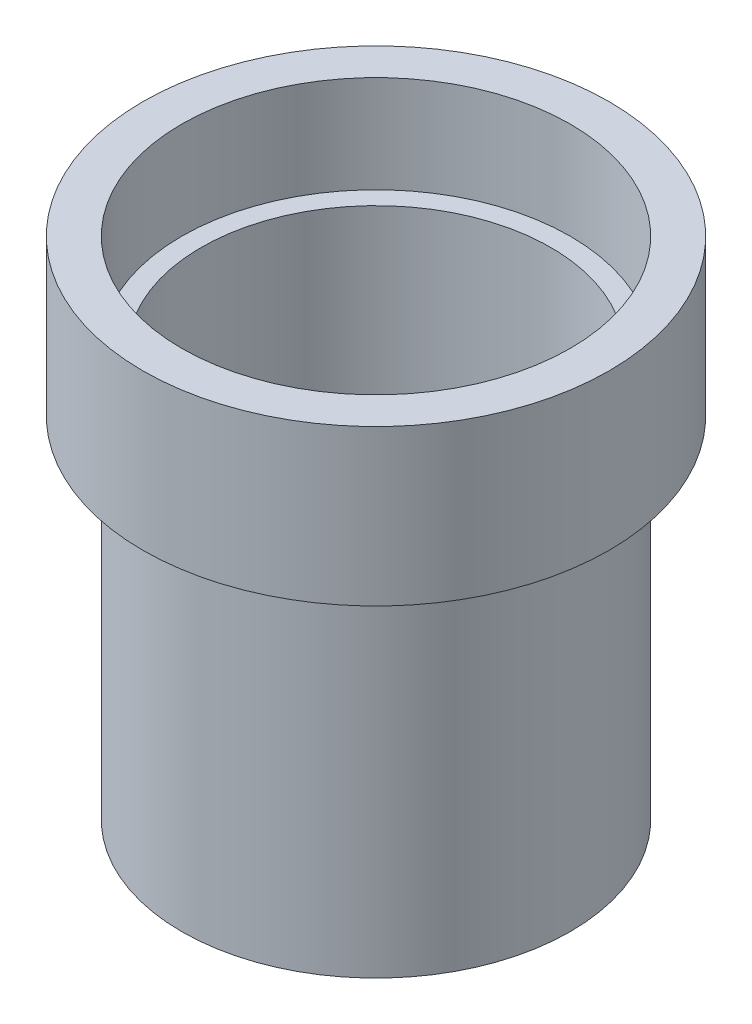
ISO-10303-21;
HEADER;
FILE_DESCRIPTION(('STEP AP214'),'2;1');
FILE_NAME('part.step','',(''),(''),'','','');
FILE_SCHEMA(('AUTOMOTIVE_DESIGN { 1 0 10303 214 1 1 1 1 }'));
ENDSEC;
DATA;
#1=APPLICATION_CONTEXT('core data for automotive mechanical design processes');
#2=APPLICATION_PROTOCOL_DEFINITION('international standard','automotive_design',2000,#1);
#3=PRODUCT_CONTEXT('',#1,'mechanical');
#4=PRODUCT('Part','Part','',(#3));
#5=PRODUCT_RELATED_PRODUCT_CATEGORY('part','',(#4));
#6=PRODUCT_DEFINITION_FORMATION('','',#4);
#7=PRODUCT_DEFINITION_CONTEXT('part definition',#1,'design');
#8=PRODUCT_DEFINITION('design','',#6,#7);
#9=PRODUCT_DEFINITION_SHAPE('','',#8);
#10=(LENGTH_UNIT() NAMED_UNIT(*) SI_UNIT(.MILLI.,.METRE.));
#11=(NAMED_UNIT(*) PLANE_ANGLE_UNIT() SI_UNIT($,.RADIAN.));
#12=(NAMED_UNIT(*) SI_UNIT($,.STERADIAN.) SOLID_ANGLE_UNIT());
#13=UNCERTAINTY_MEASURE_WITH_UNIT(LENGTH_MEASURE(1.E-05),#10,'distance_accuracy_value','');
#14=(GEOMETRIC_REPRESENTATION_CONTEXT(3) GLOBAL_UNCERTAINTY_ASSIGNED_CONTEXT((#13)) GLOBAL_UNIT_ASSIGNED_CONTEXT((#10,
#11,#12)) REPRESENTATION_CONTEXT('',''));
#15=CARTESIAN_POINT('',(0.,0.,0.));
#16=DIRECTION('',(0.,0.,1.));
#17=DIRECTION('',(1.,0.,0.));
#18=AXIS2_PLACEMENT_3D('',#15,#16,#17);
#19=CARTESIAN_POINT('',(0.,10.5,0.));
#20=DIRECTION('',(0.,1.,0.));
#21=DIRECTION('',(0.,0.,1.));
#22=AXIS2_PLACEMENT_3D('',#19,#20,#21);
#23=PLANE('',#22);
#24=CARTESIAN_POINT('',(0.,10.5,0.));
#25=DIRECTION('',(0.,1.,0.));
#26=DIRECTION('',(0.,0.,1.));
#27=AXIS2_PLACEMENT_3D('',#24,#25,#26);
#28=CIRCLE('',#27,4.5);
#29=CARTESIAN_POINT('',(0.,10.5,4.5));
#30=VERTEX_POINT('',#29);
#31=EDGE_CURVE('E50',#30,#30,#28,.F.);
#32=ORIENTED_EDGE('',*,*,#31,.T.);
#33=EDGE_LOOP('',(#32));
#34=FACE_BOUND('',#33,.T.);
#35=CARTESIAN_POINT('',(0.,10.5,0.));
#36=DIRECTION('',(0.,1.,0.));
#37=DIRECTION('',(0.,0.,1.));
#38=AXIS2_PLACEMENT_3D('',#35,#36,#37);
#39=CIRCLE('',#38,5.);
#40=CARTESIAN_POINT('',(0.,10.5,5.));
#41=VERTEX_POINT('',#40);
#42=EDGE_CURVE('E60',#41,#41,#39,.T.);
#43=ORIENTED_EDGE('',*,*,#42,.T.);
#44=EDGE_LOOP('',(#43));
#45=FACE_BOUND('',#44,.T.);
#46=ADVANCED_FACE('F35',(#34,#45),#23,.T.);
#47=CARTESIAN_POINT('',(0.,0.,0.));
#48=DIRECTION('',(0.,1.,0.));
#49=DIRECTION('',(0.,0.,1.));
#50=AXIS2_PLACEMENT_3D('',#47,#48,#49);
#51=PLANE('',#50);
#52=CARTESIAN_POINT('',(0.,0.,0.));
#53=DIRECTION('',(0.,1.,0.));
#54=DIRECTION('',(0.,0.,1.));
#55=AXIS2_PLACEMENT_3D('',#52,#53,#54);
#56=CIRCLE('',#55,5.);
#57=CARTESIAN_POINT('',(0.,0.,5.));
#58=VERTEX_POINT('',#57);
#59=EDGE_CURVE('E39',#58,#58,#56,.T.);
#60=ORIENTED_EDGE('',*,*,#59,.F.);
#61=EDGE_LOOP('',(#60));
#62=FACE_BOUND('',#61,.T.);
#63=CARTESIAN_POINT('',(0.,0.,0.));
#64=DIRECTION('',(0.,1.,0.));
#65=DIRECTION('',(0.,0.,1.));
#66=AXIS2_PLACEMENT_3D('',#63,#64,#65);
#67=CIRCLE('',#66,4.5);
#68=CARTESIAN_POINT('',(0.,0.,4.5));
#69=VERTEX_POINT('',#68);
#70=EDGE_CURVE('E46',#69,#69,#67,.T.);
#71=ORIENTED_EDGE('',*,*,#70,.T.);
#72=EDGE_LOOP('',(#71));
#73=FACE_BOUND('',#72,.T.);
#74=ADVANCED_FACE('F83',(#62,#73),#51,.F.);
#75=CARTESIAN_POINT('',(0.,9.,0.));
#76=DIRECTION('',(0.,-1.,0.));
#77=DIRECTION('',(0.,0.,-1.));
#78=AXIS2_PLACEMENT_3D('',#75,#76,#77);
#79=CYLINDRICAL_SURFACE('',#78,5.);
#80=CARTESIAN_POINT('',(0.,9.,0.));
#81=DIRECTION('',(0.,1.,0.));
#82=DIRECTION('',(0.,0.,1.));
#83=AXIS2_PLACEMENT_3D('',#80,#81,#82);
#84=CIRCLE('',#83,5.);
#85=CARTESIAN_POINT('',(0.,9.,5.));
#86=VERTEX_POINT('',#85);
#87=EDGE_CURVE('E10',#86,#86,#84,.T.);
#88=ORIENTED_EDGE('',*,*,#87,.F.);
#89=EDGE_LOOP('',(#88));
#90=FACE_BOUND('',#89,.T.);
#91=ORIENTED_EDGE('',*,*,#59,.T.);
#92=EDGE_LOOP('',(#91));
#93=FACE_BOUND('',#92,.T.);
#94=ADVANCED_FACE('F37',(#90,#93),#79,.T.);
#95=CARTESIAN_POINT('',(0.,9.,0.));
#96=DIRECTION('',(0.,-1.,0.));
#97=DIRECTION('',(0.,0.,-1.));
#98=AXIS2_PLACEMENT_3D('',#95,#96,#97);
#99=CYLINDRICAL_SURFACE('',#98,4.5);
#100=ORIENTED_EDGE('',*,*,#70,.F.);
#101=EDGE_LOOP('',(#100));
#102=FACE_BOUND('',#101,.T.);
#103=ORIENTED_EDGE('',*,*,#31,.F.);
#104=EDGE_LOOP('',(#103));
#105=FACE_BOUND('',#104,.T.);
#106=ADVANCED_FACE('F93',(#102,#105),#99,.F.);
#107=CARTESIAN_POINT('',(0.,10.5,0.));
#108=DIRECTION('',(0.,-1.,0.));
#109=DIRECTION('',(0.,0.,-1.));
#110=AXIS2_PLACEMENT_3D('',#107,#108,#109);
#111=CYLINDRICAL_SURFACE('',#110,6.);
#112=CARTESIAN_POINT('',(0.,9.,0.));
#113=DIRECTION('',(0.,1.,0.));
#114=DIRECTION('',(0.,0.,1.));
#115=AXIS2_PLACEMENT_3D('',#112,#113,#114);
#116=CIRCLE('',#115,6.);
#117=CARTESIAN_POINT('',(0.,9.,6.));
#118=VERTEX_POINT('',#117);
#119=EDGE_CURVE('E51',#118,#118,#116,.T.);
#120=ORIENTED_EDGE('',*,*,#119,.T.);
#121=EDGE_LOOP('',(#120));
#122=FACE_BOUND('',#121,.T.);
#123=CARTESIAN_POINT('',(0.,13.,0.));
#124=DIRECTION('',(0.,1.,0.));
#125=DIRECTION('',(0.,0.,1.));
#126=AXIS2_PLACEMENT_3D('',#123,#124,#125);
#127=CIRCLE('',#126,6.);
#128=CARTESIAN_POINT('',(0.,13.,6.));
#129=VERTEX_POINT('',#128);
#130=EDGE_CURVE('E54',#129,#129,#127,.T.);
#131=ORIENTED_EDGE('',*,*,#130,.F.);
#132=EDGE_LOOP('',(#131));
#133=FACE_BOUND('',#132,.T.);
#134=ADVANCED_FACE('F79',(#122,#133),#111,.T.);
#135=CARTESIAN_POINT('',(0.,9.,0.));
#136=DIRECTION('',(0.,1.,0.));
#137=DIRECTION('',(0.,0.,1.));
#138=AXIS2_PLACEMENT_3D('',#135,#136,#137);
#139=PLANE('',#138);
#140=ORIENTED_EDGE('',*,*,#87,.T.);
#141=EDGE_LOOP('',(#140));
#142=FACE_BOUND('',#141,.T.);
#143=ORIENTED_EDGE('',*,*,#119,.F.);
#144=EDGE_LOOP('',(#143));
#145=FACE_BOUND('',#144,.T.);
#146=ADVANCED_FACE('F71',(#142,#145),#139,.F.);
#147=CARTESIAN_POINT('',(0.,13.,0.));
#148=DIRECTION('',(0.,1.,0.));
#149=DIRECTION('',(0.,0.,1.));
#150=AXIS2_PLACEMENT_3D('',#147,#148,#149);
#151=PLANE('',#150);
#152=ORIENTED_EDGE('',*,*,#130,.T.);
#153=EDGE_LOOP('',(#152));
#154=FACE_BOUND('',#153,.T.);
#155=CARTESIAN_POINT('',(0.,13.,0.));
#156=DIRECTION('',(0.,1.,0.));
#157=DIRECTION('',(0.,0.,1.));
#158=AXIS2_PLACEMENT_3D('',#155,#156,#157);
#159=CIRCLE('',#158,5.);
#160=CARTESIAN_POINT('',(0.,13.,5.));
#161=VERTEX_POINT('',#160);
#162=EDGE_CURVE('E59',#161,#161,#159,.T.);
#163=ORIENTED_EDGE('',*,*,#162,.F.);
#164=EDGE_LOOP('',(#163));
#165=FACE_BOUND('',#164,.T.);
#166=ADVANCED_FACE('F69',(#154,#165),#151,.T.);
#167=CARTESIAN_POINT('',(0.,13.,0.));
#168=DIRECTION('',(0.,-1.,0.));
#169=DIRECTION('',(0.,0.,-1.));
#170=AXIS2_PLACEMENT_3D('',#167,#168,#169);
#171=CYLINDRICAL_SURFACE('',#170,5.);
#172=ORIENTED_EDGE('',*,*,#162,.T.);
#173=EDGE_LOOP('',(#172));
#174=FACE_BOUND('',#173,.T.);
#175=ORIENTED_EDGE('',*,*,#42,.F.);
#176=EDGE_LOOP('',(#175));
#177=FACE_BOUND('',#176,.T.);
#178=ADVANCED_FACE('F66',(#174,#177),#171,.F.);
#179=CLOSED_SHELL('',(#46,#74,#94,#106,#134,#146,#166,#178));
#180=MANIFOLD_SOLID_BREP('B2',#179);
#181=ADVANCED_BREP_SHAPE_REPRESENTATION('',(#18,#180),#14);
#182=SHAPE_DEFINITION_REPRESENTATION(#9,#181);
ENDSEC;
END-ISO-10303-21;
